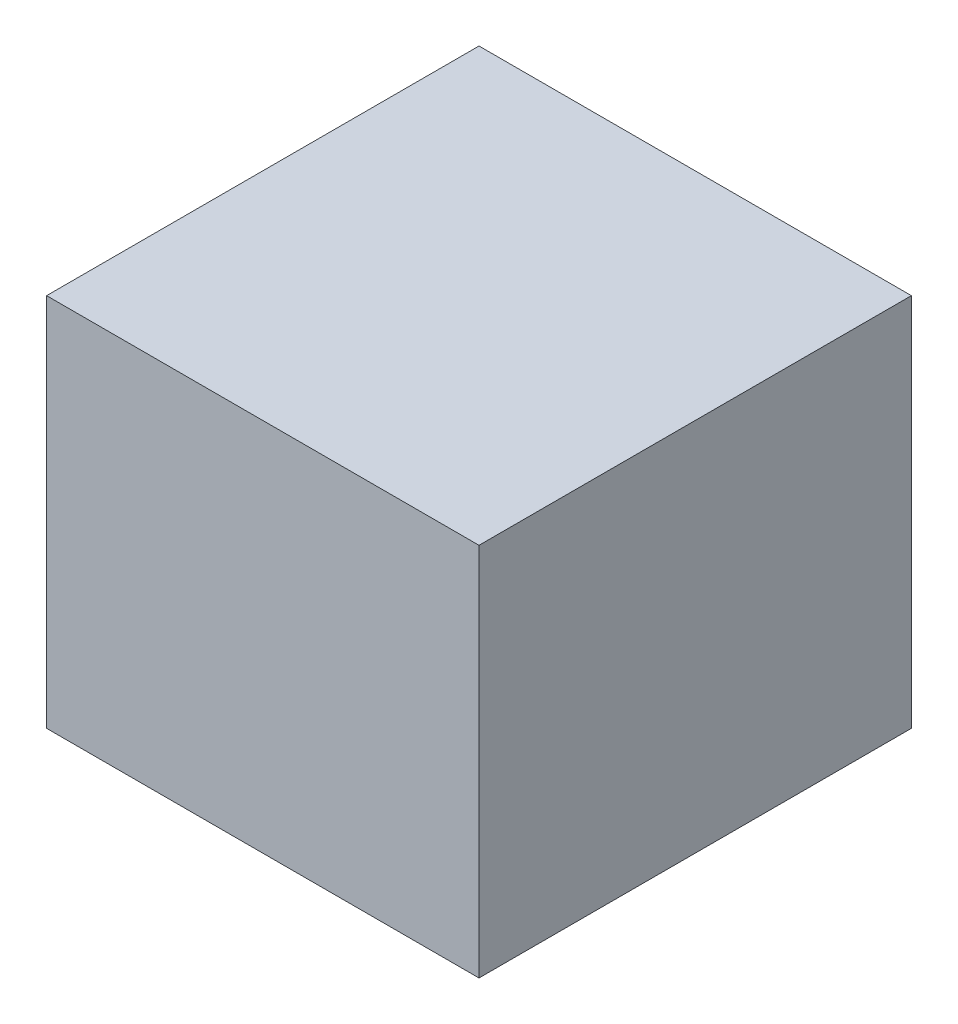
ISO-10303-21;
HEADER;
FILE_DESCRIPTION(('STEP AP214'),'2;1');
FILE_NAME('part.step','',(''),(''),'','','');
FILE_SCHEMA(('AUTOMOTIVE_DESIGN { 1 0 10303 214 1 1 1 1 }'));
ENDSEC;
DATA;
#1=APPLICATION_CONTEXT('core data for automotive mechanical design processes');
#2=APPLICATION_PROTOCOL_DEFINITION('international standard','automotive_design',2000,#1);
#3=PRODUCT_CONTEXT('',#1,'mechanical');
#4=PRODUCT('Part','Part','',(#3));
#5=PRODUCT_RELATED_PRODUCT_CATEGORY('part','',(#4));
#6=PRODUCT_DEFINITION_FORMATION('','',#4);
#7=PRODUCT_DEFINITION_CONTEXT('part definition',#1,'design');
#8=PRODUCT_DEFINITION('design','',#6,#7);
#9=PRODUCT_DEFINITION_SHAPE('','',#8);
#10=(LENGTH_UNIT() NAMED_UNIT(*) SI_UNIT(.MILLI.,.METRE.));
#11=(NAMED_UNIT(*) PLANE_ANGLE_UNIT() SI_UNIT($,.RADIAN.));
#12=(NAMED_UNIT(*) SI_UNIT($,.STERADIAN.) SOLID_ANGLE_UNIT());
#13=UNCERTAINTY_MEASURE_WITH_UNIT(LENGTH_MEASURE(1.E-05),#10,'distance_accuracy_value','');
#14=(GEOMETRIC_REPRESENTATION_CONTEXT(3) GLOBAL_UNCERTAINTY_ASSIGNED_CONTEXT((#13)) GLOBAL_UNIT_ASSIGNED_CONTEXT((#10,
#11,#12)) REPRESENTATION_CONTEXT('',''));
#15=CARTESIAN_POINT('',(0.,0.,0.));
#16=DIRECTION('',(0.,0.,1.));
#17=DIRECTION('',(1.,0.,0.));
#18=AXIS2_PLACEMENT_3D('',#15,#16,#17);
#19=CARTESIAN_POINT('',(37.5,65.,-37.5));
#20=DIRECTION('',(-1.,0.,0.));
#21=DIRECTION('',(0.,0.,1.));
#22=AXIS2_PLACEMENT_3D('',#19,#20,#21);
#23=PLANE('',#22);
#24=DIRECTION('',(0.,0.,-1.));
#25=VECTOR('',#24,1.);
#26=CARTESIAN_POINT('',(37.5,0.,-37.5));
#27=LINE('',#26,#25);
#28=CARTESIAN_POINT('',(37.5,0.,37.5));
#29=VERTEX_POINT('',#28);
#30=CARTESIAN_POINT('',(37.5,0.,-37.5));
#31=VERTEX_POINT('',#30);
#32=EDGE_CURVE('E96',#29,#31,#27,.T.);
#33=ORIENTED_EDGE('',*,*,#32,.T.);
#34=DIRECTION('',(0.,-1.,0.));
#35=VECTOR('',#34,1.);
#36=CARTESIAN_POINT('',(37.5,65.,-37.5));
#37=LINE('',#36,#35);
#38=CARTESIAN_POINT('',(37.5,65.,-37.5));
#39=VERTEX_POINT('',#38);
#40=EDGE_CURVE('E11',#39,#31,#37,.T.);
#41=ORIENTED_EDGE('',*,*,#40,.F.);
#42=DIRECTION('',(0.,0.,-1.));
#43=VECTOR('',#42,1.);
#44=CARTESIAN_POINT('',(37.5,65.,-37.5));
#45=LINE('',#44,#43);
#46=CARTESIAN_POINT('',(37.5,65.,37.5));
#47=VERTEX_POINT('',#46);
#48=EDGE_CURVE('E84',#47,#39,#45,.T.);
#49=ORIENTED_EDGE('',*,*,#48,.F.);
#50=DIRECTION('',(0.,-1.,0.));
#51=VECTOR('',#50,1.);
#52=CARTESIAN_POINT('',(37.5,65.,37.5));
#53=LINE('',#52,#51);
#54=EDGE_CURVE('E92',#47,#29,#53,.T.);
#55=ORIENTED_EDGE('',*,*,#54,.T.);
#56=EDGE_LOOP('',(#33,#41,#49,#55));
#57=FACE_BOUND('',#56,.T.);
#58=ADVANCED_FACE('F33',(#57),#23,.F.);
#59=CARTESIAN_POINT('',(-37.5,65.,-37.5));
#60=DIRECTION('',(0.,0.,1.));
#61=DIRECTION('',(1.,0.,0.));
#62=AXIS2_PLACEMENT_3D('',#59,#60,#61);
#63=PLANE('',#62);
#64=DIRECTION('',(-1.,0.,0.));
#65=VECTOR('',#64,1.);
#66=CARTESIAN_POINT('',(-37.5,0.,-37.5));
#67=LINE('',#66,#65);
#68=CARTESIAN_POINT('',(-37.5,0.,-37.5));
#69=VERTEX_POINT('',#68);
#70=EDGE_CURVE('E88',#31,#69,#67,.T.);
#71=ORIENTED_EDGE('',*,*,#70,.T.);
#72=DIRECTION('',(0.,-1.,0.));
#73=VECTOR('',#72,1.);
#74=CARTESIAN_POINT('',(-37.5,65.,-37.5));
#75=LINE('',#74,#73);
#76=CARTESIAN_POINT('',(-37.5,65.,-37.5));
#77=VERTEX_POINT('',#76);
#78=EDGE_CURVE('E41',#77,#69,#75,.T.);
#79=ORIENTED_EDGE('',*,*,#78,.F.);
#80=DIRECTION('',(-1.,0.,0.));
#81=VECTOR('',#80,1.);
#82=CARTESIAN_POINT('',(-37.5,65.,-37.5));
#83=LINE('',#82,#81);
#84=EDGE_CURVE('E79',#39,#77,#83,.T.);
#85=ORIENTED_EDGE('',*,*,#84,.F.);
#86=ORIENTED_EDGE('',*,*,#40,.T.);
#87=EDGE_LOOP('',(#71,#79,#85,#86));
#88=FACE_BOUND('',#87,.T.);
#89=ADVANCED_FACE('F87',(#88),#63,.F.);
#90=CARTESIAN_POINT('',(-37.5,65.,-37.5));
#91=DIRECTION('',(1.,0.,0.));
#92=DIRECTION('',(0.,0.,-1.));
#93=AXIS2_PLACEMENT_3D('',#90,#91,#92);
#94=PLANE('',#93);
#95=DIRECTION('',(0.,0.,1.));
#96=VECTOR('',#95,1.);
#97=CARTESIAN_POINT('',(-37.5,0.,-37.5));
#98=LINE('',#97,#96);
#99=CARTESIAN_POINT('',(-37.5,0.,37.5));
#100=VERTEX_POINT('',#99);
#101=EDGE_CURVE('E66',#69,#100,#98,.T.);
#102=ORIENTED_EDGE('',*,*,#101,.T.);
#103=DIRECTION('',(0.,-1.,0.));
#104=VECTOR('',#103,1.);
#105=CARTESIAN_POINT('',(-37.5,65.,37.5));
#106=LINE('',#105,#104);
#107=CARTESIAN_POINT('',(-37.5,65.,37.5));
#108=VERTEX_POINT('',#107);
#109=EDGE_CURVE('E89',#108,#100,#106,.T.);
#110=ORIENTED_EDGE('',*,*,#109,.F.);
#111=DIRECTION('',(0.,0.,1.));
#112=VECTOR('',#111,1.);
#113=CARTESIAN_POINT('',(-37.5,65.,-37.5));
#114=LINE('',#113,#112);
#115=EDGE_CURVE('E82',#77,#108,#114,.T.);
#116=ORIENTED_EDGE('',*,*,#115,.F.);
#117=ORIENTED_EDGE('',*,*,#78,.T.);
#118=EDGE_LOOP('',(#102,#110,#116,#117));
#119=FACE_BOUND('',#118,.T.);
#120=ADVANCED_FACE('F90',(#119),#94,.F.);
#121=CARTESIAN_POINT('',(-37.5,65.,37.5));
#122=DIRECTION('',(0.,0.,-1.));
#123=DIRECTION('',(-1.,0.,0.));
#124=AXIS2_PLACEMENT_3D('',#121,#122,#123);
#125=PLANE('',#124);
#126=DIRECTION('',(1.,0.,0.));
#127=VECTOR('',#126,1.);
#128=CARTESIAN_POINT('',(-37.5,0.,37.5));
#129=LINE('',#128,#127);
#130=EDGE_CURVE('E72',#100,#29,#129,.T.);
#131=ORIENTED_EDGE('',*,*,#130,.T.);
#132=ORIENTED_EDGE('',*,*,#54,.F.);
#133=DIRECTION('',(1.,0.,0.));
#134=VECTOR('',#133,1.);
#135=CARTESIAN_POINT('',(-37.5,65.,37.5));
#136=LINE('',#135,#134);
#137=EDGE_CURVE('E49',#108,#47,#136,.T.);
#138=ORIENTED_EDGE('',*,*,#137,.F.);
#139=ORIENTED_EDGE('',*,*,#109,.T.);
#140=EDGE_LOOP('',(#131,#132,#138,#139));
#141=FACE_BOUND('',#140,.T.);
#142=ADVANCED_FACE('F103',(#141),#125,.F.);
#143=CARTESIAN_POINT('',(0.,65.,0.));
#144=DIRECTION('',(0.,1.,0.));
#145=DIRECTION('',(0.,0.,1.));
#146=AXIS2_PLACEMENT_3D('',#143,#144,#145);
#147=PLANE('',#146);
#148=ORIENTED_EDGE('',*,*,#48,.T.);
#149=ORIENTED_EDGE('',*,*,#84,.T.);
#150=ORIENTED_EDGE('',*,*,#115,.T.);
#151=ORIENTED_EDGE('',*,*,#137,.T.);
#152=EDGE_LOOP('',(#148,#149,#150,#151));
#153=FACE_BOUND('',#152,.T.);
#154=ADVANCED_FACE('F80',(#153),#147,.T.);
#155=CARTESIAN_POINT('',(0.,0.,0.));
#156=DIRECTION('',(0.,1.,0.));
#157=DIRECTION('',(0.,0.,1.));
#158=AXIS2_PLACEMENT_3D('',#155,#156,#157);
#159=PLANE('',#158);
#160=ORIENTED_EDGE('',*,*,#32,.F.);
#161=ORIENTED_EDGE('',*,*,#130,.F.);
#162=ORIENTED_EDGE('',*,*,#101,.F.);
#163=ORIENTED_EDGE('',*,*,#70,.F.);
#164=EDGE_LOOP('',(#160,#161,#162,#163));
#165=FACE_BOUND('',#164,.T.);
#166=ADVANCED_FACE('F106',(#165),#159,.F.);
#167=CLOSED_SHELL('',(#58,#89,#120,#142,#154,#166));
#168=MANIFOLD_SOLID_BREP('B2',#167);
#169=ADVANCED_BREP_SHAPE_REPRESENTATION('',(#18,#168),#14);
#170=SHAPE_DEFINITION_REPRESENTATION(#9,#169);
ENDSEC;
END-ISO-10303-21;
